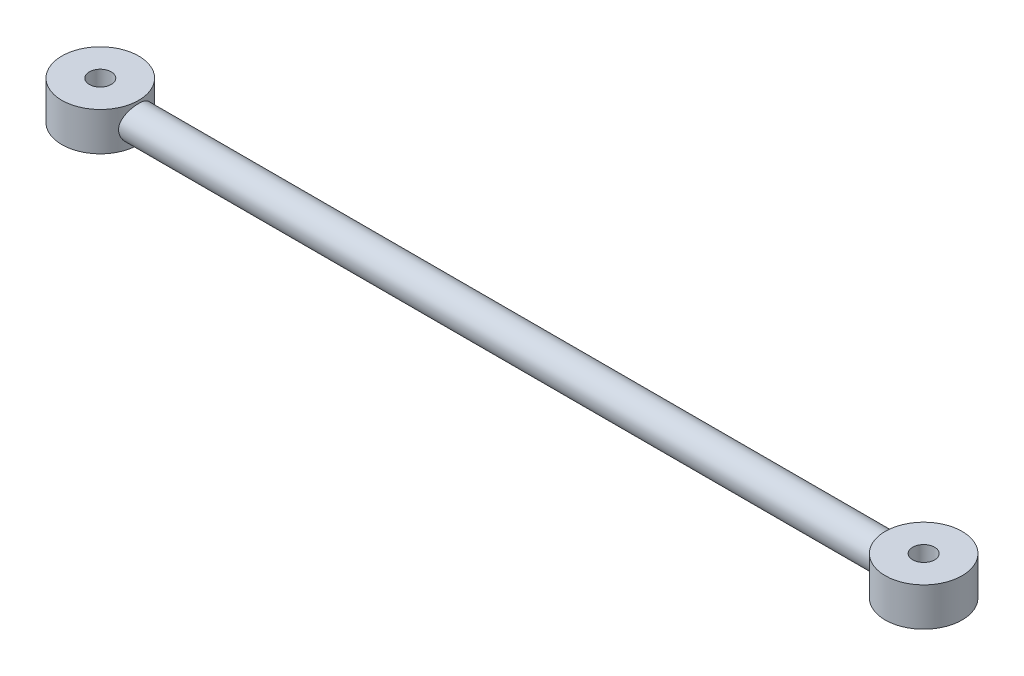
ISO-10303-21;
HEADER;
FILE_DESCRIPTION(('STEP AP214'),'2;1');
FILE_NAME('part.step','',(''),(''),'','','');
FILE_SCHEMA(('AUTOMOTIVE_DESIGN { 1 0 10303 214 1 1 1 1 }'));
ENDSEC;
DATA;
#1=APPLICATION_CONTEXT('core data for automotive mechanical design processes');
#2=APPLICATION_PROTOCOL_DEFINITION('international standard','automotive_design',2000,#1);
#3=PRODUCT_CONTEXT('',#1,'mechanical');
#4=PRODUCT('Part','Part','',(#3));
#5=PRODUCT_RELATED_PRODUCT_CATEGORY('part','',(#4));
#6=PRODUCT_DEFINITION_FORMATION('','',#4);
#7=PRODUCT_DEFINITION_CONTEXT('part definition',#1,'design');
#8=PRODUCT_DEFINITION('design','',#6,#7);
#9=PRODUCT_DEFINITION_SHAPE('','',#8);
#10=(LENGTH_UNIT() NAMED_UNIT(*) SI_UNIT(.MILLI.,.METRE.));
#11=(NAMED_UNIT(*) PLANE_ANGLE_UNIT() SI_UNIT($,.RADIAN.));
#12=(NAMED_UNIT(*) SI_UNIT($,.STERADIAN.) SOLID_ANGLE_UNIT());
#13=UNCERTAINTY_MEASURE_WITH_UNIT(LENGTH_MEASURE(1.E-05),#10,'distance_accuracy_value','');
#14=(GEOMETRIC_REPRESENTATION_CONTEXT(3) GLOBAL_UNCERTAINTY_ASSIGNED_CONTEXT((#13)) GLOBAL_UNIT_ASSIGNED_CONTEXT((#10,
#11,#12)) REPRESENTATION_CONTEXT('',''));
#15=CARTESIAN_POINT('',(0.,0.,0.));
#16=DIRECTION('',(0.,0.,1.));
#17=DIRECTION('',(1.,0.,0.));
#18=AXIS2_PLACEMENT_3D('',#15,#16,#17);
#19=CARTESIAN_POINT('',(0.,7.,0.));
#20=DIRECTION('',(0.,-1.,0.));
#21=DIRECTION('',(0.,0.,-1.));
#22=AXIS2_PLACEMENT_3D('',#19,#20,#21);
#23=CYLINDRICAL_SURFACE('',#22,7.);
#24=CARTESIAN_POINT('',(0.,7.,0.));
#25=DIRECTION('',(0.,1.,0.));
#26=DIRECTION('',(0.,0.,1.));
#27=AXIS2_PLACEMENT_3D('',#24,#25,#26);
#28=CIRCLE('',#27,7.);
#29=CARTESIAN_POINT('',(0.,7.,7.));
#30=VERTEX_POINT('',#29);
#31=EDGE_CURVE('E42',#30,#30,#28,.T.);
#32=ORIENTED_EDGE('',*,*,#31,.F.);
#33=EDGE_LOOP('',(#32));
#34=FACE_BOUND('',#33,.T.);
#35=CARTESIAN_POINT('',(0.,0.,0.));
#36=DIRECTION('',(0.,1.,0.));
#37=DIRECTION('',(0.,0.,1.));
#38=AXIS2_PLACEMENT_3D('',#35,#36,#37);
#39=CIRCLE('',#38,7.);
#40=CARTESIAN_POINT('',(0.,0.,7.));
#41=VERTEX_POINT('',#40);
#42=EDGE_CURVE('E46',#41,#41,#39,.T.);
#43=ORIENTED_EDGE('',*,*,#42,.T.);
#44=EDGE_LOOP('',(#43));
#45=FACE_BOUND('',#44,.T.);
#46=CARTESIAN_POINT('',(6.32455532033676,3.5,3.));
#47=CARTESIAN_POINT('',(6.32455623917925,3.42019923696911,2.99999904512121));
#48=CARTESIAN_POINT('',(6.32607259589376,3.34036918002945,2.99680914186365));
#49=CARTESIAN_POINT('',(6.33207844610818,3.18131310904515,2.98409481890062));
#50=CARTESIAN_POINT('',(6.33656983318198,3.10208751223992,2.97456636476115));
#51=CARTESIAN_POINT('',(6.35433138320313,2.86591097345671,2.93654933365817));
#52=CARTESIAN_POINT('',(6.3718883479981,2.71068003414275,2.8986294210123));
#53=CARTESIAN_POINT('',(6.41604959211165,2.41012968440135,2.79949691759116));
#54=CARTESIAN_POINT('',(6.44261548670749,2.2647713124138,2.73838302089271));
#55=CARTESIAN_POINT('',(6.50173461776113,1.98637445600225,2.59488993442856));
#56=CARTESIAN_POINT('',(6.53428667863442,1.8533335603279,2.51251491871712));
#57=CARTESIAN_POINT('',(6.604111083221,1.59454716049575,2.32303426891366));
#58=CARTESIAN_POINT('',(6.64154929418065,1.46971373094871,2.21474428773221));
#59=CARTESIAN_POINT('',(6.71556787556132,1.23929814294093,1.9789916252315));
#60=CARTESIAN_POINT('',(6.75214789882674,1.13372366200242,1.85152133453084));
#61=CARTESIAN_POINT('',(6.82236442416004,0.940080759541392,1.5737748906695));
#62=CARTESIAN_POINT('',(6.85578586283844,0.853050747922684,1.42271545416052));
#63=CARTESIAN_POINT('',(6.91387422205065,0.706035833355378,1.10640716164424));
#64=CARTESIAN_POINT('',(6.93854524147057,0.646038264254936,0.941164994307303));
#65=CARTESIAN_POINT('',(6.97517471062289,0.558134963639046,0.610764262051987));
#66=CARTESIAN_POINT('',(6.98775448299434,0.5286539309609,0.446095117735235));
#67=CARTESIAN_POINT('',(7.00104925914407,0.497517303282849,0.113699399968668));
#68=CARTESIAN_POINT('',(7.00176937203861,0.495849726301001,-0.0540258257506384));
#69=CARTESIAN_POINT('',(6.99162033228837,0.519590247791058,-0.376268415183327));
#70=CARTESIAN_POINT('',(6.98149359551672,0.543263799683697,-0.530941438169347));
#71=CARTESIAN_POINT('',(6.95182205628876,0.614024068920169,-0.833871717827574));
#72=CARTESIAN_POINT('',(6.93227655784003,0.661112516498579,-0.982128499493937));
#73=CARTESIAN_POINT('',(6.88526693329208,0.77790658965267,-1.27075797068383));
#74=CARTESIAN_POINT('',(6.85768620781763,0.847947292329128,-1.41097529460904));
#75=CARTESIAN_POINT('',(6.79727675004241,1.0083173553763,-1.67803533028446));
#76=CARTESIAN_POINT('',(6.76444613359548,1.09865400454071,-1.8048732130277));
#77=CARTESIAN_POINT('',(6.69393790301249,1.30480950667601,-2.05154784007323));
#78=CARTESIAN_POINT('',(6.65608139107459,1.42201886977399,-2.1701729768624));
#79=CARTESIAN_POINT('',(6.58157631342609,1.67470283164954,-2.38662617777592));
#80=CARTESIAN_POINT('',(6.5449282748833,1.81018527380674,-2.48444526456874));
#81=CARTESIAN_POINT('',(6.47566835431168,2.10177987447147,-2.65987942757701));
#82=CARTESIAN_POINT('',(6.44325238173047,2.25846414548125,-2.73662769389096));
#83=CARTESIAN_POINT('',(6.3884939447888,2.58428900834334,-2.86214771894642));
#84=CARTESIAN_POINT('',(6.36614379619967,2.75341998325804,-2.9109408263676));
#85=CARTESIAN_POINT('',(6.33598550498636,3.08717279561205,-2.9759867011968));
#86=CARTESIAN_POINT('',(6.32729797712828,3.25132898060731,-2.99421280080632));
#87=CARTESIAN_POINT('',(6.32292988606605,3.58054897510828,-3.00343131976712));
#88=CARTESIAN_POINT('',(6.32724437007431,3.74561241510746,-2.99443410914468));
#89=CARTESIAN_POINT('',(6.34748143158175,4.05986257374344,-2.9512647841786));
#90=CARTESIAN_POINT('',(6.36257694871081,4.20935574037177,-2.9188846108295));
#91=CARTESIAN_POINT('',(6.40159573000742,4.50064547636968,-2.83228012727602));
#92=CARTESIAN_POINT('',(6.42552113853308,4.64244016654448,-2.77805051059372));
#93=CARTESIAN_POINT('',(6.48076667248579,4.92120989029112,-2.64668378105435));
#94=CARTESIAN_POINT('',(6.51236308247384,5.05770732182204,-2.5686531941561));
#95=CARTESIAN_POINT('',(6.57901833984006,5.31635070551129,-2.39277124314047));
#96=CARTESIAN_POINT('',(6.61407874120977,5.43849016219808,-2.29491096228641));
#97=CARTESIAN_POINT('',(6.68739396565838,5.6760289255727,-2.07211495440809));
#98=CARTESIAN_POINT('',(6.72566111015056,5.78991523722376,-1.94556360485738));
#99=CARTESIAN_POINT('',(6.79826947497518,5.9951342372748,-1.67428466903032));
#100=CARTESIAN_POINT('',(6.83261030191759,6.08646466679208,-1.5295552644811));
#101=CARTESIAN_POINT('',(6.89381439172467,6.24408268980707,-1.2245807874168));
#102=CARTESIAN_POINT('',(6.92064008929576,6.3102450462872,-1.06426298143306));
#103=CARTESIAN_POINT('',(6.96347660484597,6.41414979815623,-0.733319762769437));
#104=CARTESIAN_POINT('',(6.9794942735468,6.45191019800838,-0.562700954301774));
#105=CARTESIAN_POINT('',(6.99808081286415,6.49557746015662,-0.22948038459567));
#106=CARTESIAN_POINT('',(7.00154837158207,6.50361382051941,-0.0672060876467148));
#107=CARTESIAN_POINT('',(6.99717401704727,6.49340448125966,0.256339620951763));
#108=CARTESIAN_POINT('',(6.98933429595527,6.47516387599597,0.41761122090852));
#109=CARTESIAN_POINT('',(6.96371224258031,6.41444649582745,0.728044798339694));
#110=CARTESIAN_POINT('',(6.9463310265813,6.37294615263452,0.877433690400419));
#111=CARTESIAN_POINT('',(6.90358200259661,6.26798381608021,1.16704890744754));
#112=CARTESIAN_POINT('',(6.87821272472253,6.20451778058432,1.30727354037359));
#113=CARTESIAN_POINT('',(6.82048100144583,6.05421011216401,1.58164154030708));
#114=CARTESIAN_POINT('',(6.78785230171247,5.96643407814648,1.71521554911027));
#115=CARTESIAN_POINT('',(6.71941601876114,5.7713182864619,1.96631980223032));
#116=CARTESIAN_POINT('',(6.68360718068102,5.66397078827051,2.08384366642576));
#117=CARTESIAN_POINT('',(6.60956029826528,5.42361613655686,2.30839582375668));
#118=CARTESIAN_POINT('',(6.57133471854879,5.28931158538104,2.41404185093548));
#119=CARTESIAN_POINT('',(6.49938146624856,5.0036538672722,2.60157161791914));
#120=CARTESIAN_POINT('',(6.46565641748318,4.85229084924017,2.68344152863089));
#121=CARTESIAN_POINT('',(6.42172587804179,4.61561755892372,2.78618250414778));
#122=CARTESIAN_POINT('',(6.40819457191417,4.53514424084097,2.81707998873811));
#123=CARTESIAN_POINT('',(6.38380411418013,4.37148377716792,2.87192428390112));
#124=CARTESIAN_POINT('',(6.37294364206054,4.28829799580876,2.89587453038153));
#125=CARTESIAN_POINT('',(6.35433014729515,4.12006919231867,2.93649221837599));
#126=CARTESIAN_POINT('',(6.3465689441917,4.03503169261803,2.9531788427136));
#127=CARTESIAN_POINT('',(6.33442493706763,3.86363722828714,2.97913893233313));
#128=CARTESIAN_POINT('',(6.33003954418514,3.77728132665879,2.9884180785096));
#129=CARTESIAN_POINT('',(6.32647229512562,3.65893859982364,2.99595579124565));
#130=CARTESIAN_POINT('',(6.32575401974705,3.62717571924005,2.99747183035651));
#131=CARTESIAN_POINT('',(6.3247953454093,3.56361011083144,2.99949413311609));
#132=CARTESIAN_POINT('',(6.32455495409998,3.5318073823767,3.00000038060031));
#133=CARTESIAN_POINT('',(6.32455532033676,3.5,3.));
#134=B_SPLINE_CURVE_WITH_KNOTS('',3,(#46,#47,#48,#49,#50,#51,#52,#53,#54,#55,#56,#57,#58,#59,
#60,#61,#62,#63,#64,#65,#66,#67,#68,#69,#70,#71,#72,#73,#74,#75,#76,#77,#78,#79,#80,#81,#82,#83,
#84,#85,#86,#87,#88,#89,#90,#91,#92,#93,#94,#95,#96,#97,#98,#99,#100,#101,#102,#103,#104,#105,
#106,#107,#108,#109,#110,#111,#112,#113,#114,#115,#116,#117,#118,#119,#120,#121,#122,#123,#124,
#125,#126,#127,#128,#129,#130,#131,#132,#133),.UNSPECIFIED.,.T.,.F.,(4,2,2,2,2,2,2,2,2,2,2,2,2,
2,2,2,2,2,2,2,2,2,2,2,2,2,2,2,2,2,2,2,2,2,2,2,2,2,2,2,2,2,2,4),(0.,0.239366653231037,
0.478885807272612,0.958574399125933,1.43624431857918,1.91382053150697,2.41995684393642,
2.92629448725105,3.45610451675016,3.98566604296334,4.48627308722847,4.98666446539179,
5.45487182502104,5.92311378779298,6.39852111765622,6.8740994521391,7.38485137094338,
7.89582322238327,8.42542768080316,8.95462715213609,9.44812252419892,9.94142993544506,
10.4004743903489,10.8596303986217,11.3387499488479,11.8180854227975,12.3391595177845,
12.8602857751477,13.3839722669446,13.9073265049035,14.3923682623503,14.8773159966024,
15.3432850585276,15.8093399138768,16.2966585998759,16.784170440423,17.3070906286303,
17.8303143607246,18.0917878499581,18.3531318004373,18.6137813055803,18.8742307225593,
18.9696371385413,19.0650450817536),.UNSPECIFIED.);
#135=CARTESIAN_POINT('',(6.32455532033676,3.5,3.));
#136=VERTEX_POINT('',#135);
#137=EDGE_CURVE('E10',#136,#136,#134,.T.);
#138=ORIENTED_EDGE('',*,*,#137,.F.);
#139=EDGE_LOOP('',(#138));
#140=FACE_BOUND('',#139,.T.);
#141=ADVANCED_FACE('F31',(#34,#45,#140),#23,.T.);
#142=CARTESIAN_POINT('',(0.,7.,0.));
#143=DIRECTION('',(0.,1.,0.));
#144=DIRECTION('',(0.,0.,1.));
#145=AXIS2_PLACEMENT_3D('',#142,#143,#144);
#146=PLANE('',#145);
#147=ORIENTED_EDGE('',*,*,#31,.T.);
#148=EDGE_LOOP('',(#147));
#149=FACE_BOUND('',#148,.T.);
#150=CARTESIAN_POINT('',(0.,7.,0.));
#151=DIRECTION('',(0.,1.,0.));
#152=DIRECTION('',(0.,0.,1.));
#153=AXIS2_PLACEMENT_3D('',#150,#151,#152);
#154=CIRCLE('',#153,2.);
#155=CARTESIAN_POINT('',(0.,7.,2.));
#156=VERTEX_POINT('',#155);
#157=EDGE_CURVE('E51',#156,#156,#154,.T.);
#158=ORIENTED_EDGE('',*,*,#157,.F.);
#159=EDGE_LOOP('',(#158));
#160=FACE_BOUND('',#159,.T.);
#161=ADVANCED_FACE('F93',(#149,#160),#146,.T.);
#162=CARTESIAN_POINT('',(0.,0.,0.));
#163=DIRECTION('',(0.,1.,0.));
#164=DIRECTION('',(0.,0.,1.));
#165=AXIS2_PLACEMENT_3D('',#162,#163,#164);
#166=PLANE('',#165);
#167=ORIENTED_EDGE('',*,*,#42,.F.);
#168=EDGE_LOOP('',(#167));
#169=FACE_BOUND('',#168,.T.);
#170=CARTESIAN_POINT('',(0.,0.,0.));
#171=DIRECTION('',(0.,1.,0.));
#172=DIRECTION('',(0.,0.,1.));
#173=AXIS2_PLACEMENT_3D('',#170,#171,#172);
#174=CIRCLE('',#173,2.);
#175=CARTESIAN_POINT('',(0.,0.,2.));
#176=VERTEX_POINT('',#175);
#177=EDGE_CURVE('E53',#176,#176,#174,.T.);
#178=ORIENTED_EDGE('',*,*,#177,.T.);
#179=EDGE_LOOP('',(#178));
#180=FACE_BOUND('',#179,.T.);
#181=ADVANCED_FACE('F98',(#169,#180),#166,.F.);
#182=CARTESIAN_POINT('',(0.,7.,0.));
#183=DIRECTION('',(0.,-1.,0.));
#184=DIRECTION('',(0.,0.,-1.));
#185=AXIS2_PLACEMENT_3D('',#182,#183,#184);
#186=CYLINDRICAL_SURFACE('',#185,2.);
#187=ORIENTED_EDGE('',*,*,#157,.T.);
#188=EDGE_LOOP('',(#187));
#189=FACE_BOUND('',#188,.T.);
#190=ORIENTED_EDGE('',*,*,#177,.F.);
#191=EDGE_LOOP('',(#190));
#192=FACE_BOUND('',#191,.T.);
#193=ADVANCED_FACE('F106',(#189,#192),#186,.F.);
#194=CARTESIAN_POINT('',(157.001,3.5,0.));
#195=DIRECTION('',(-1.,0.,0.));
#196=DIRECTION('',(0.,0.,1.));
#197=AXIS2_PLACEMENT_3D('',#194,#195,#196);
#198=CYLINDRICAL_SURFACE('',#197,3.);
#199=CARTESIAN_POINT('',(143.675444679663,3.5,3.));
#200=CARTESIAN_POINT('',(143.675443760821,3.42019923696911,2.99999904512121));
#201=CARTESIAN_POINT('',(143.673927404106,3.34036918002945,2.99680914186365));
#202=CARTESIAN_POINT('',(143.667921553892,3.18131310904515,2.98409481890062));
#203=CARTESIAN_POINT('',(143.663430166818,3.10208751223992,2.97456636476115));
#204=CARTESIAN_POINT('',(143.645668616797,2.86591097345671,2.93654933365817));
#205=CARTESIAN_POINT('',(143.628111652002,2.71068003414276,2.8986294210123));
#206=CARTESIAN_POINT('',(143.583950407888,2.41012968440135,2.79949691759116));
#207=CARTESIAN_POINT('',(143.557384513293,2.26477131241379,2.73838302089271));
#208=CARTESIAN_POINT('',(143.498265382239,1.98637445600225,2.59488993442855));
#209=CARTESIAN_POINT('',(143.465713321366,1.8533335603279,2.51251491871712));
#210=CARTESIAN_POINT('',(143.395888916779,1.59454716049575,2.32303426891366));
#211=CARTESIAN_POINT('',(143.358450705819,1.46971373094871,2.21474428773221));
#212=CARTESIAN_POINT('',(143.284432124439,1.23929814294094,1.97899162523151));
#213=CARTESIAN_POINT('',(143.247852101173,1.13372366200242,1.85152133453084));
#214=CARTESIAN_POINT('',(143.17763557584,0.940080759541396,1.57377489066951));
#215=CARTESIAN_POINT('',(143.144214137162,0.853050747922688,1.42271545416053));
#216=CARTESIAN_POINT('',(143.086125777949,0.706035833355381,1.10640716164425));
#217=CARTESIAN_POINT('',(143.061454758529,0.646038264254939,0.94116499430731));
#218=CARTESIAN_POINT('',(143.024825289377,0.558134963639048,0.610764262051993));
#219=CARTESIAN_POINT('',(143.012245517006,0.5286539309609,0.446095117735241));
#220=CARTESIAN_POINT('',(142.998950740856,0.497517303282848,0.113699399968673));
#221=CARTESIAN_POINT('',(142.998230627961,0.495849726301001,-0.0540258257506325));
#222=CARTESIAN_POINT('',(143.008379667712,0.519590247791057,-0.376268415183322));
#223=CARTESIAN_POINT('',(143.018506404483,0.543263799683696,-0.530941438169342));
#224=CARTESIAN_POINT('',(143.048177943711,0.614024068920168,-0.83387171782757));
#225=CARTESIAN_POINT('',(143.06772344216,0.661112516498578,-0.982128499493932));
#226=CARTESIAN_POINT('',(143.114733066708,0.777906589652669,-1.27075797068383));
#227=CARTESIAN_POINT('',(143.142313792182,0.847947292329127,-1.41097529460903));
#228=CARTESIAN_POINT('',(143.202723249958,1.0083173553763,-1.67803533028446));
#229=CARTESIAN_POINT('',(143.235553866405,1.09865400454071,-1.8048732130277));
#230=CARTESIAN_POINT('',(143.306062096988,1.30480950667601,-2.05154784007322));
#231=CARTESIAN_POINT('',(143.343918608925,1.42201886977399,-2.1701729768624));
#232=CARTESIAN_POINT('',(143.418423686574,1.67470283164954,-2.38662617777592));
#233=CARTESIAN_POINT('',(143.455071725117,1.81018527380674,-2.48444526456873));
#234=CARTESIAN_POINT('',(143.524331645688,2.10177987447147,-2.65987942757701));
#235=CARTESIAN_POINT('',(143.55674761827,2.25846414548125,-2.73662769389096));
#236=CARTESIAN_POINT('',(143.611506055211,2.58428900834334,-2.86214771894642));
#237=CARTESIAN_POINT('',(143.6338562038,2.75341998325803,-2.9109408263676));
#238=CARTESIAN_POINT('',(143.664014495014,3.08717279561205,-2.9759867011968));
#239=CARTESIAN_POINT('',(143.672702022872,3.2513289806073,-2.99421280080632));
#240=CARTESIAN_POINT('',(143.677070113934,3.58054897510828,-3.00343131976712));
#241=CARTESIAN_POINT('',(143.672755629926,3.74561241510746,-2.99443410914468));
#242=CARTESIAN_POINT('',(143.652518568418,4.05986257374344,-2.9512647841786));
#243=CARTESIAN_POINT('',(143.637423051289,4.20935574037177,-2.9188846108295));
#244=CARTESIAN_POINT('',(143.598404269993,4.50064547636968,-2.83228012727602));
#245=CARTESIAN_POINT('',(143.574478861467,4.64244016654448,-2.77805051059372));
#246=CARTESIAN_POINT('',(143.519233327514,4.92120989029112,-2.64668378105435));
#247=CARTESIAN_POINT('',(143.487636917526,5.05770732182203,-2.5686531941561));
#248=CARTESIAN_POINT('',(143.42098166016,5.31635070551129,-2.39277124314048));
#249=CARTESIAN_POINT('',(143.38592125879,5.43849016219807,-2.29491096228642));
#250=CARTESIAN_POINT('',(143.312606034342,5.6760289255727,-2.07211495440809));
#251=CARTESIAN_POINT('',(143.274338889849,5.78991523722376,-1.94556360485739));
#252=CARTESIAN_POINT('',(143.201730525025,5.9951342372748,-1.67428466903032));
#253=CARTESIAN_POINT('',(143.167389698082,6.08646466679208,-1.5295552644811));
#254=CARTESIAN_POINT('',(143.106185608275,6.24408268980707,-1.2245807874168));
#255=CARTESIAN_POINT('',(143.079359910704,6.3102450462872,-1.06426298143306));
#256=CARTESIAN_POINT('',(143.036523395154,6.41414979815623,-0.733319762769438));
#257=CARTESIAN_POINT('',(143.020505726453,6.45191019800838,-0.562700954301775));
#258=CARTESIAN_POINT('',(143.001919187136,6.49557746015662,-0.22948038459567));
#259=CARTESIAN_POINT('',(142.998451628418,6.50361382051941,-0.0672060876467145));
#260=CARTESIAN_POINT('',(143.002825982953,6.49340448125966,0.256339620951763));
#261=CARTESIAN_POINT('',(143.010665704045,6.47516387599597,0.417611220908519));
#262=CARTESIAN_POINT('',(143.03628775742,6.41444649582745,0.728044798339692));
#263=CARTESIAN_POINT('',(143.053668973419,6.37294615263452,0.877433690400416));
#264=CARTESIAN_POINT('',(143.096417997403,6.26798381608021,1.16704890744753));
#265=CARTESIAN_POINT('',(143.121787275277,6.20451778058433,1.30727354037359));
#266=CARTESIAN_POINT('',(143.179518998554,6.05421011216401,1.58164154030708));
#267=CARTESIAN_POINT('',(143.212147698288,5.96643407814648,1.71521554911027));
#268=CARTESIAN_POINT('',(143.280583981239,5.7713182864619,1.96631980223032));
#269=CARTESIAN_POINT('',(143.316392819319,5.66397078827052,2.08384366642575));
#270=CARTESIAN_POINT('',(143.390439701735,5.42361613655686,2.30839582375667));
#271=CARTESIAN_POINT('',(143.428665281451,5.28931158538105,2.41404185093547));
#272=CARTESIAN_POINT('',(143.500618533751,5.0036538672722,2.60157161791914));
#273=CARTESIAN_POINT('',(143.534343582517,4.85229084924018,2.68344152863089));
#274=CARTESIAN_POINT('',(143.578274121958,4.61561755892372,2.78618250414778));
#275=CARTESIAN_POINT('',(143.591805428086,4.53514424084098,2.81707998873811));
#276=CARTESIAN_POINT('',(143.61619588582,4.37148377716792,2.87192428390112));
#277=CARTESIAN_POINT('',(143.627056357939,4.28829799580877,2.89587453038153));
#278=CARTESIAN_POINT('',(143.645669852705,4.12006919231868,2.93649221837599));
#279=CARTESIAN_POINT('',(143.653431055808,4.03503169261803,2.9531788427136));
#280=CARTESIAN_POINT('',(143.665575062932,3.86363722828715,2.97913893233313));
#281=CARTESIAN_POINT('',(143.669960455815,3.77728132665879,2.9884180785096));
#282=CARTESIAN_POINT('',(143.673527704874,3.65893859982364,2.99595579124565));
#283=CARTESIAN_POINT('',(143.674245980253,3.62717571924005,2.99747183035651));
#284=CARTESIAN_POINT('',(143.675204654591,3.56361011083144,2.99949413311609));
#285=CARTESIAN_POINT('',(143.6754450459,3.5318073823767,3.00000038060031));
#286=CARTESIAN_POINT('',(143.675444679663,3.5,3.));
#287=B_SPLINE_CURVE_WITH_KNOTS('',3,(#199,#200,#201,#202,#203,#204,#205,#206,#207,#208,#209,
#210,#211,#212,#213,#214,#215,#216,#217,#218,#219,#220,#221,#222,#223,#224,#225,#226,#227,#228,
#229,#230,#231,#232,#233,#234,#235,#236,#237,#238,#239,#240,#241,#242,#243,#244,#245,#246,#247,
#248,#249,#250,#251,#252,#253,#254,#255,#256,#257,#258,#259,#260,#261,#262,#263,#264,#265,#266,
#267,#268,#269,#270,#271,#272,#273,#274,#275,#276,#277,#278,#279,#280,#281,#282,#283,#284,#285,
#286),.UNSPECIFIED.,.T.,.F.,(4,2,2,2,2,2,2,2,2,2,2,2,2,2,2,2,2,2,2,2,2,2,2,2,2,2,2,2,2,2,2,2,2,
2,2,2,2,2,2,2,2,2,2,4),(0.,0.239366653231038,0.478885807272612,0.958574399125931,
1.43624431857919,1.91382053150697,2.41995684393642,2.92629448725105,3.45610451675015,
3.98566604296333,4.48627308722846,4.98666446539178,5.45487182502104,5.92311378779297,
6.39852111765622,6.87409945213909,7.38485137094337,7.89582322238327,8.42542768080316,
8.95462715213609,9.44812252419892,9.94142993544505,10.4004743903489,10.8596303986217,
11.3387499488479,11.8180854227975,12.3391595177845,12.8602857751477,13.3839722669446,
13.9073265049036,14.3923682623503,14.8773159966024,15.3432850585276,15.8093399138768,
16.2966585998759,16.784170440423,17.3070906286303,17.8303143607246,18.0917878499581,
18.3531318004373,18.6137813055803,18.8742307225593,18.9696371385413,19.0650450817536),.UNSPECIFIED.);
#288=CARTESIAN_POINT('',(143.675444679663,3.5,3.));
#289=VERTEX_POINT('',#288);
#290=EDGE_CURVE('E56',#289,#289,#287,.T.);
#291=ORIENTED_EDGE('',*,*,#290,.F.);
#292=EDGE_LOOP('',(#291));
#293=FACE_BOUND('',#292,.T.);
#294=ORIENTED_EDGE('',*,*,#137,.T.);
#295=EDGE_LOOP('',(#294));
#296=FACE_BOUND('',#295,.T.);
#297=ADVANCED_FACE('F68',(#293,#296),#198,.T.);
#298=CARTESIAN_POINT('',(150.,7.,0.));
#299=DIRECTION('',(0.,-1.,0.));
#300=DIRECTION('',(0.,0.,-1.));
#301=AXIS2_PLACEMENT_3D('',#298,#299,#300);
#302=CYLINDRICAL_SURFACE('',#301,6.99999999999998);
#303=CARTESIAN_POINT('',(150.,0.,0.));
#304=DIRECTION('',(0.,1.,0.));
#305=DIRECTION('',(0.,0.,1.));
#306=AXIS2_PLACEMENT_3D('',#303,#304,#305);
#307=CIRCLE('',#306,6.99999999999998);
#308=CARTESIAN_POINT('',(150.,0.,6.99999999999998));
#309=VERTEX_POINT('',#308);
#310=EDGE_CURVE('E66',#309,#309,#307,.T.);
#311=ORIENTED_EDGE('',*,*,#310,.T.);
#312=EDGE_LOOP('',(#311));
#313=FACE_BOUND('',#312,.T.);
#314=CARTESIAN_POINT('',(150.,7.,0.));
#315=DIRECTION('',(0.,1.,0.));
#316=DIRECTION('',(0.,0.,1.));
#317=AXIS2_PLACEMENT_3D('',#314,#315,#316);
#318=CIRCLE('',#317,6.99999999999998);
#319=CARTESIAN_POINT('',(150.,7.,6.99999999999998));
#320=VERTEX_POINT('',#319);
#321=EDGE_CURVE('E65',#320,#320,#318,.T.);
#322=ORIENTED_EDGE('',*,*,#321,.F.);
#323=EDGE_LOOP('',(#322));
#324=FACE_BOUND('',#323,.T.);
#325=ORIENTED_EDGE('',*,*,#290,.T.);
#326=EDGE_LOOP('',(#325));
#327=FACE_BOUND('',#326,.T.);
#328=ADVANCED_FACE('F73',(#313,#324,#327),#302,.T.);
#329=CARTESIAN_POINT('',(150.,7.,0.));
#330=DIRECTION('',(0.,1.,0.));
#331=DIRECTION('',(0.,0.,1.));
#332=AXIS2_PLACEMENT_3D('',#329,#330,#331);
#333=PLANE('',#332);
#334=ORIENTED_EDGE('',*,*,#321,.T.);
#335=EDGE_LOOP('',(#334));
#336=FACE_BOUND('',#335,.T.);
#337=CARTESIAN_POINT('',(150.,7.,0.));
#338=DIRECTION('',(0.,1.,0.));
#339=DIRECTION('',(0.,0.,1.));
#340=AXIS2_PLACEMENT_3D('',#337,#338,#339);
#341=CIRCLE('',#340,2.);
#342=CARTESIAN_POINT('',(150.,7.,2.));
#343=VERTEX_POINT('',#342);
#344=EDGE_CURVE('E168',#343,#343,#341,.T.);
#345=ORIENTED_EDGE('',*,*,#344,.F.);
#346=EDGE_LOOP('',(#345));
#347=FACE_BOUND('',#346,.T.);
#348=ADVANCED_FACE('F76',(#336,#347),#333,.T.);
#349=CARTESIAN_POINT('',(150.,0.,0.));
#350=DIRECTION('',(0.,1.,0.));
#351=DIRECTION('',(0.,0.,1.));
#352=AXIS2_PLACEMENT_3D('',#349,#350,#351);
#353=PLANE('',#352);
#354=ORIENTED_EDGE('',*,*,#310,.F.);
#355=EDGE_LOOP('',(#354));
#356=FACE_BOUND('',#355,.T.);
#357=CARTESIAN_POINT('',(150.,0.,0.));
#358=DIRECTION('',(0.,1.,0.));
#359=DIRECTION('',(0.,0.,1.));
#360=AXIS2_PLACEMENT_3D('',#357,#358,#359);
#361=CIRCLE('',#360,2.);
#362=CARTESIAN_POINT('',(150.,0.,2.));
#363=VERTEX_POINT('',#362);
#364=EDGE_CURVE('E171',#363,#363,#361,.T.);
#365=ORIENTED_EDGE('',*,*,#364,.T.);
#366=EDGE_LOOP('',(#365));
#367=FACE_BOUND('',#366,.T.);
#368=ADVANCED_FACE('F78',(#356,#367),#353,.F.);
#369=CARTESIAN_POINT('',(150.,7.,0.));
#370=DIRECTION('',(0.,-1.,0.));
#371=DIRECTION('',(0.,0.,-1.));
#372=AXIS2_PLACEMENT_3D('',#369,#370,#371);
#373=CYLINDRICAL_SURFACE('',#372,2.);
#374=ORIENTED_EDGE('',*,*,#344,.T.);
#375=EDGE_LOOP('',(#374));
#376=FACE_BOUND('',#375,.T.);
#377=ORIENTED_EDGE('',*,*,#364,.F.);
#378=EDGE_LOOP('',(#377));
#379=FACE_BOUND('',#378,.T.);
#380=ADVANCED_FACE('F81',(#376,#379),#373,.F.);
#381=CLOSED_SHELL('',(#141,#161,#181,#193,#297,#328,#348,#368,#380));
#382=MANIFOLD_SOLID_BREP('B2',#381);
#383=ADVANCED_BREP_SHAPE_REPRESENTATION('',(#18,#382),#14);
#384=SHAPE_DEFINITION_REPRESENTATION(#9,#383);
ENDSEC;
END-ISO-10303-21;
